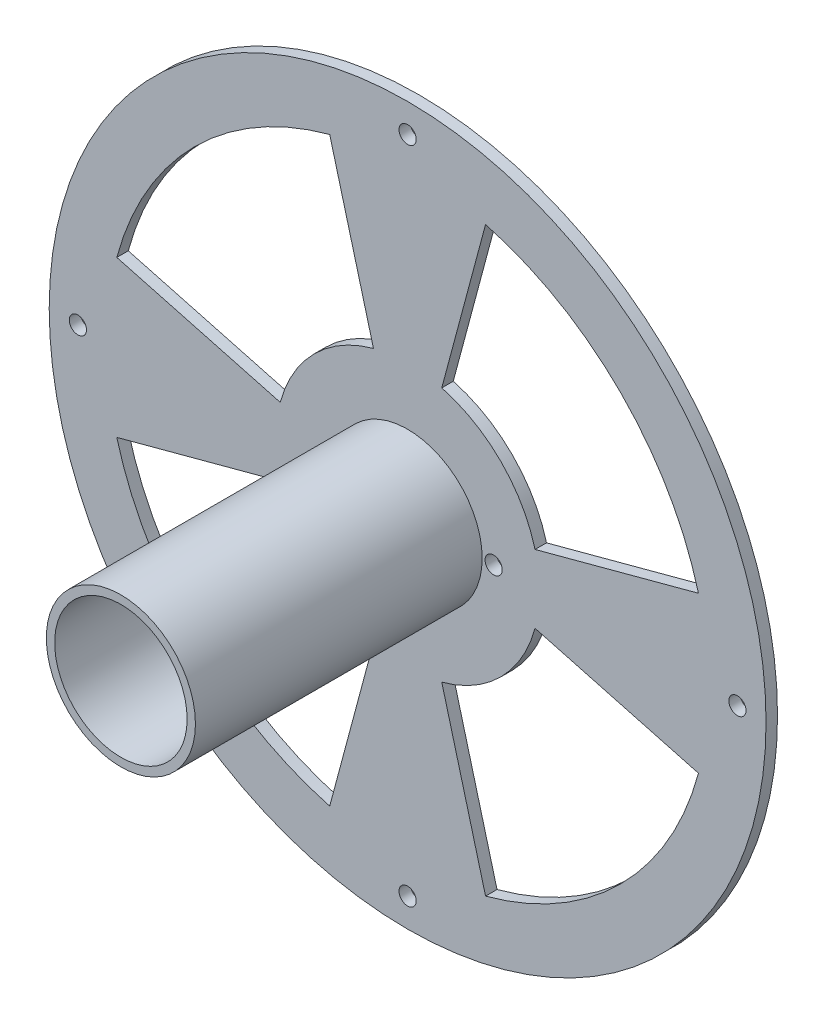
ISO-10303-21;
HEADER;
FILE_DESCRIPTION(('STEP AP214'),'2;1');
FILE_NAME('part.step','',(''),(''),'','','');
FILE_SCHEMA(('AUTOMOTIVE_DESIGN { 1 0 10303 214 1 1 1 1 }'));
ENDSEC;
DATA;
#1=APPLICATION_CONTEXT('core data for automotive mechanical design processes');
#2=APPLICATION_PROTOCOL_DEFINITION('international standard','automotive_design',2000,#1);
#3=PRODUCT_CONTEXT('',#1,'mechanical');
#4=PRODUCT('Part','Part','',(#3));
#5=PRODUCT_RELATED_PRODUCT_CATEGORY('part','',(#4));
#6=PRODUCT_DEFINITION_FORMATION('','',#4);
#7=PRODUCT_DEFINITION_CONTEXT('part definition',#1,'design');
#8=PRODUCT_DEFINITION('design','',#6,#7);
#9=PRODUCT_DEFINITION_SHAPE('','',#8);
#10=(LENGTH_UNIT() NAMED_UNIT(*) SI_UNIT(.MILLI.,.METRE.));
#11=(NAMED_UNIT(*) PLANE_ANGLE_UNIT() SI_UNIT($,.RADIAN.));
#12=(NAMED_UNIT(*) SI_UNIT($,.STERADIAN.) SOLID_ANGLE_UNIT());
#13=UNCERTAINTY_MEASURE_WITH_UNIT(LENGTH_MEASURE(1.E-05),#10,'distance_accuracy_value','');
#14=(GEOMETRIC_REPRESENTATION_CONTEXT(3) GLOBAL_UNCERTAINTY_ASSIGNED_CONTEXT((#13)) GLOBAL_UNIT_ASSIGNED_CONTEXT((#10,
#11,#12)) REPRESENTATION_CONTEXT('',''));
#15=CARTESIAN_POINT('',(0.,0.,0.));
#16=DIRECTION('',(0.,0.,1.));
#17=DIRECTION('',(1.,0.,0.));
#18=AXIS2_PLACEMENT_3D('',#15,#16,#17);
#19=CARTESIAN_POINT('',(0.,0.,2.));
#20=DIRECTION('',(0.,0.,1.));
#21=DIRECTION('',(1.,0.,0.));
#22=AXIS2_PLACEMENT_3D('',#19,#20,#21);
#23=PLANE('',#22);
#24=CARTESIAN_POINT('',(0.,0.,2.));
#25=DIRECTION('',(0.,0.,1.));
#26=DIRECTION('',(1.,0.,0.));
#27=AXIS2_PLACEMENT_3D('',#24,#25,#26);
#28=CIRCLE('',#27,52.5);
#29=CARTESIAN_POINT('',(-50.7111058801761,-13.5879998678824,2.));
#30=VERTEX_POINT('',#29);
#31=CARTESIAN_POINT('',(-13.587999867882,-50.7111058801762,2.));
#32=VERTEX_POINT('',#31);
#33=EDGE_CURVE('E48',#30,#32,#28,.T.);
#34=ORIENTED_EDGE('',*,*,#33,.F.);
#35=DIRECTION('',(-0.965925826289068,-0.258819045102522,0.));
#36=VECTOR('',#35,1.);
#37=CARTESIAN_POINT('',(-22.2162940046486,-5.952838037358,2.));
#38=LINE('',#37,#36);
#39=CARTESIAN_POINT('',(-22.2162940046486,-5.952838037358,2.));
#40=VERTEX_POINT('',#39);
#41=EDGE_CURVE('E167',#40,#30,#38,.T.);
#42=ORIENTED_EDGE('',*,*,#41,.F.);
#43=CARTESIAN_POINT('',(0.,0.,2.));
#44=DIRECTION('',(0.,0.,-1.));
#45=DIRECTION('',(1.,0.,0.));
#46=AXIS2_PLACEMENT_3D('',#43,#44,#45);
#47=CIRCLE('',#46,23.);
#48=CARTESIAN_POINT('',(-5.95283803735783,-22.2162940046486,2.));
#49=VERTEX_POINT('',#48);
#50=EDGE_CURVE('E170',#49,#40,#47,.T.);
#51=ORIENTED_EDGE('',*,*,#50,.F.);
#52=DIRECTION('',(0.258819045102514,0.96592582628907,0.));
#53=VECTOR('',#52,1.);
#54=CARTESIAN_POINT('',(-5.95283803735783,-22.2162940046486,2.));
#55=LINE('',#54,#53);
#56=EDGE_CURVE('E176',#32,#49,#55,.T.);
#57=ORIENTED_EDGE('',*,*,#56,.F.);
#58=EDGE_LOOP('',(#34,#42,#51,#57));
#59=FACE_BOUND('',#58,.T.);
#60=CARTESIAN_POINT('',(0.,0.,2.));
#61=DIRECTION('',(0.,0.,1.));
#62=DIRECTION('',(1.,0.,0.));
#63=AXIS2_PLACEMENT_3D('',#60,#61,#62);
#64=CIRCLE('',#63,52.5);
#65=CARTESIAN_POINT('',(-13.5879998678824,50.7111058801761,2.));
#66=VERTEX_POINT('',#65);
#67=CARTESIAN_POINT('',(-50.7111058801762,13.587999867882,2.));
#68=VERTEX_POINT('',#67);
#69=EDGE_CURVE('E56',#66,#68,#64,.T.);
#70=ORIENTED_EDGE('',*,*,#69,.F.);
#71=DIRECTION('',(-0.258819045102522,0.965925826289068,0.));
#72=VECTOR('',#71,1.);
#73=CARTESIAN_POINT('',(-5.952838037358,22.2162940046486,2.));
#74=LINE('',#73,#72);
#75=CARTESIAN_POINT('',(-5.952838037358,22.2162940046486,2.));
#76=VERTEX_POINT('',#75);
#77=EDGE_CURVE('E191',#76,#66,#74,.T.);
#78=ORIENTED_EDGE('',*,*,#77,.F.);
#79=CARTESIAN_POINT('',(0.,0.,2.));
#80=DIRECTION('',(0.,0.,-1.));
#81=DIRECTION('',(1.,0.,0.));
#82=AXIS2_PLACEMENT_3D('',#79,#80,#81);
#83=CIRCLE('',#82,23.);
#84=CARTESIAN_POINT('',(-22.2162940046486,5.95283803735783,2.));
#85=VERTEX_POINT('',#84);
#86=EDGE_CURVE('E206',#85,#76,#83,.T.);
#87=ORIENTED_EDGE('',*,*,#86,.F.);
#88=DIRECTION('',(0.96592582628907,-0.258819045102514,0.));
#89=VECTOR('',#88,1.);
#90=CARTESIAN_POINT('',(-22.2162940046486,5.95283803735783,2.));
#91=LINE('',#90,#89);
#92=EDGE_CURVE('E202',#68,#85,#91,.T.);
#93=ORIENTED_EDGE('',*,*,#92,.F.);
#94=EDGE_LOOP('',(#70,#78,#87,#93));
#95=FACE_BOUND('',#94,.T.);
#96=CARTESIAN_POINT('',(0.,0.,2.));
#97=DIRECTION('',(0.,0.,1.));
#98=DIRECTION('',(1.,0.,0.));
#99=AXIS2_PLACEMENT_3D('',#96,#97,#98);
#100=CIRCLE('',#99,52.5);
#101=CARTESIAN_POINT('',(50.7111058801761,13.5879998678824,2.));
#102=VERTEX_POINT('',#101);
#103=CARTESIAN_POINT('',(13.587999867882,50.7111058801762,2.));
#104=VERTEX_POINT('',#103);
#105=EDGE_CURVE('E231',#102,#104,#100,.T.);
#106=ORIENTED_EDGE('',*,*,#105,.F.);
#107=DIRECTION('',(0.965925826289068,0.258819045102522,0.));
#108=VECTOR('',#107,1.);
#109=CARTESIAN_POINT('',(22.2162940046486,5.952838037358,2.));
#110=LINE('',#109,#108);
#111=CARTESIAN_POINT('',(22.2162940046486,5.952838037358,2.));
#112=VERTEX_POINT('',#111);
#113=EDGE_CURVE('E221',#112,#102,#110,.T.);
#114=ORIENTED_EDGE('',*,*,#113,.F.);
#115=CARTESIAN_POINT('',(0.,0.,2.));
#116=DIRECTION('',(0.,0.,-1.));
#117=DIRECTION('',(1.,0.,0.));
#118=AXIS2_PLACEMENT_3D('',#115,#116,#117);
#119=CIRCLE('',#118,23.);
#120=CARTESIAN_POINT('',(5.95283803735782,22.2162940046486,2.));
#121=VERTEX_POINT('',#120);
#122=EDGE_CURVE('E236',#121,#112,#119,.T.);
#123=ORIENTED_EDGE('',*,*,#122,.F.);
#124=DIRECTION('',(-0.258819045102514,-0.96592582628907,0.));
#125=VECTOR('',#124,1.);
#126=CARTESIAN_POINT('',(5.95283803735782,22.2162940046486,2.));
#127=LINE('',#126,#125);
#128=EDGE_CURVE('E233',#104,#121,#127,.T.);
#129=ORIENTED_EDGE('',*,*,#128,.F.);
#130=EDGE_LOOP('',(#106,#114,#123,#129));
#131=FACE_BOUND('',#130,.T.);
#132=CARTESIAN_POINT('',(0.,0.,2.));
#133=DIRECTION('',(0.,0.,1.));
#134=DIRECTION('',(1.,0.,0.));
#135=AXIS2_PLACEMENT_3D('',#132,#133,#134);
#136=CIRCLE('',#135,52.5);
#137=CARTESIAN_POINT('',(13.5879998678824,-50.7111058801761,2.));
#138=VERTEX_POINT('',#137);
#139=CARTESIAN_POINT('',(50.7111058801762,-13.587999867882,2.));
#140=VERTEX_POINT('',#139);
#141=EDGE_CURVE('E183',#138,#140,#136,.T.);
#142=ORIENTED_EDGE('',*,*,#141,.F.);
#143=DIRECTION('',(0.258819045102522,-0.965925826289068,0.));
#144=VECTOR('',#143,1.);
#145=CARTESIAN_POINT('',(5.952838037358,-22.2162940046486,2.));
#146=LINE('',#145,#144);
#147=CARTESIAN_POINT('',(5.95283803735799,-22.2162940046486,2.));
#148=VERTEX_POINT('',#147);
#149=EDGE_CURVE('E252',#148,#138,#146,.T.);
#150=ORIENTED_EDGE('',*,*,#149,.F.);
#151=CARTESIAN_POINT('',(0.,0.,2.));
#152=DIRECTION('',(0.,0.,-1.));
#153=DIRECTION('',(1.,0.,0.));
#154=AXIS2_PLACEMENT_3D('',#151,#152,#153);
#155=CIRCLE('',#154,23.);
#156=CARTESIAN_POINT('',(22.2162940046486,-5.95283803735783,2.));
#157=VERTEX_POINT('',#156);
#158=EDGE_CURVE('E266',#157,#148,#155,.T.);
#159=ORIENTED_EDGE('',*,*,#158,.F.);
#160=DIRECTION('',(-0.96592582628907,0.258819045102514,0.));
#161=VECTOR('',#160,1.);
#162=CARTESIAN_POINT('',(22.2162940046486,-5.95283803735783,2.));
#163=LINE('',#162,#161);
#164=EDGE_CURVE('E263',#140,#157,#163,.T.);
#165=ORIENTED_EDGE('',*,*,#164,.F.);
#166=EDGE_LOOP('',(#142,#150,#159,#165));
#167=FACE_BOUND('',#166,.T.);
#168=CARTESIAN_POINT('',(0.,0.,2.));
#169=DIRECTION('',(0.,0.,1.));
#170=DIRECTION('',(1.,0.,0.));
#171=AXIS2_PLACEMENT_3D('',#168,#169,#170);
#172=CIRCLE('',#171,13.);
#173=CARTESIAN_POINT('',(13.,0.,2.));
#174=VERTEX_POINT('',#173);
#175=EDGE_CURVE('E289',#174,#174,#172,.T.);
#176=ORIENTED_EDGE('',*,*,#175,.F.);
#177=EDGE_LOOP('',(#176));
#178=FACE_BOUND('',#177,.T.);
#179=CARTESIAN_POINT('',(-5.95238811855343E-13,-57.5,2.));
#180=DIRECTION('',(0.,0.,1.));
#181=DIRECTION('',(1.,0.,0.));
#182=AXIS2_PLACEMENT_3D('',#179,#180,#181);
#183=CIRCLE('',#182,1.50000000000001);
#184=CARTESIAN_POINT('',(1.49999999999941,-57.5,2.));
#185=VERTEX_POINT('',#184);
#186=EDGE_CURVE('E304',#185,#185,#183,.T.);
#187=ORIENTED_EDGE('',*,*,#186,.F.);
#188=EDGE_LOOP('',(#187));
#189=FACE_BOUND('',#188,.T.);
#190=CARTESIAN_POINT('',(1.93718457888383E-13,57.5,2.));
#191=DIRECTION('',(0.,0.,1.));
#192=DIRECTION('',(1.,0.,0.));
#193=AXIS2_PLACEMENT_3D('',#190,#191,#192);
#194=CIRCLE('',#193,1.5);
#195=CARTESIAN_POINT('',(1.5000000000002,57.5,2.));
#196=VERTEX_POINT('',#195);
#197=EDGE_CURVE('E316',#196,#196,#194,.T.);
#198=ORIENTED_EDGE('',*,*,#197,.F.);
#199=EDGE_LOOP('',(#198));
#200=FACE_BOUND('',#199,.T.);
#201=CARTESIAN_POINT('',(-57.5,0.,2.));
#202=DIRECTION('',(0.,0.,1.));
#203=DIRECTION('',(1.,0.,0.));
#204=AXIS2_PLACEMENT_3D('',#201,#202,#203);
#205=CIRCLE('',#204,1.5);
#206=CARTESIAN_POINT('',(-56.,0.,2.));
#207=VERTEX_POINT('',#206);
#208=EDGE_CURVE('E328',#207,#207,#205,.T.);
#209=ORIENTED_EDGE('',*,*,#208,.F.);
#210=EDGE_LOOP('',(#209));
#211=FACE_BOUND('',#210,.T.);
#212=CARTESIAN_POINT('',(0.,0.,2.));
#213=DIRECTION('',(0.,0.,1.));
#214=DIRECTION('',(1.,0.,0.));
#215=AXIS2_PLACEMENT_3D('',#212,#213,#214);
#216=CIRCLE('',#215,62.5);
#217=CARTESIAN_POINT('',(62.5,0.,2.));
#218=VERTEX_POINT('',#217);
#219=EDGE_CURVE('E11',#218,#218,#216,.T.);
#220=ORIENTED_EDGE('',*,*,#219,.T.);
#221=EDGE_LOOP('',(#220));
#222=FACE_BOUND('',#221,.T.);
#223=CARTESIAN_POINT('',(-15.,0.,2.));
#224=DIRECTION('',(0.,0.,1.));
#225=DIRECTION('',(1.,0.,0.));
#226=AXIS2_PLACEMENT_3D('',#223,#224,#225);
#227=CIRCLE('',#226,1.5);
#228=CARTESIAN_POINT('',(-13.5,0.,2.));
#229=VERTEX_POINT('',#228);
#230=EDGE_CURVE('E322',#229,#229,#227,.T.);
#231=ORIENTED_EDGE('',*,*,#230,.F.);
#232=EDGE_LOOP('',(#231));
#233=FACE_BOUND('',#232,.T.);
#234=CARTESIAN_POINT('',(57.5,-3.94478634871863E-13,2.));
#235=DIRECTION('',(0.,0.,1.));
#236=DIRECTION('',(1.,0.,0.));
#237=AXIS2_PLACEMENT_3D('',#234,#235,#236);
#238=CIRCLE('',#237,1.5);
#239=CARTESIAN_POINT('',(59.,-3.94478634871863E-13,2.));
#240=VERTEX_POINT('',#239);
#241=EDGE_CURVE('E310',#240,#240,#238,.T.);
#242=ORIENTED_EDGE('',*,*,#241,.F.);
#243=EDGE_LOOP('',(#242));
#244=FACE_BOUND('',#243,.T.);
#245=CARTESIAN_POINT('',(15.,0.,2.));
#246=DIRECTION('',(0.,0.,1.));
#247=DIRECTION('',(-1.,0.,0.));
#248=AXIS2_PLACEMENT_3D('',#245,#246,#247);
#249=CIRCLE('',#248,1.5);
#250=CARTESIAN_POINT('',(13.5,0.,2.));
#251=VERTEX_POINT('',#250);
#252=EDGE_CURVE('E298',#251,#251,#249,.T.);
#253=ORIENTED_EDGE('',*,*,#252,.F.);
#254=EDGE_LOOP('',(#253));
#255=FACE_BOUND('',#254,.T.);
#256=ADVANCED_FACE('F33',(#59,#95,#131,#167,#178,#189,#200,#211,#222,#233,#244,#255),#23,.T.);
#257=CARTESIAN_POINT('',(0.,0.,0.));
#258=DIRECTION('',(0.,0.,1.));
#259=DIRECTION('',(1.,0.,0.));
#260=AXIS2_PLACEMENT_3D('',#257,#258,#259);
#261=PLANE('',#260);
#262=DIRECTION('',(-0.965925826289068,-0.258819045102522,0.));
#263=VECTOR('',#262,1.);
#264=CARTESIAN_POINT('',(-22.2162940046486,-5.952838037358,0.));
#265=LINE('',#264,#263);
#266=CARTESIAN_POINT('',(-22.2162940046486,-5.952838037358,0.));
#267=VERTEX_POINT('',#266);
#268=CARTESIAN_POINT('',(-50.7111058801761,-13.5879998678824,0.));
#269=VERTEX_POINT('',#268);
#270=EDGE_CURVE('E154',#267,#269,#265,.T.);
#271=ORIENTED_EDGE('',*,*,#270,.T.);
#272=CARTESIAN_POINT('',(0.,0.,0.));
#273=DIRECTION('',(0.,0.,1.));
#274=DIRECTION('',(1.,0.,0.));
#275=AXIS2_PLACEMENT_3D('',#272,#273,#274);
#276=CIRCLE('',#275,52.5);
#277=CARTESIAN_POINT('',(-13.587999867882,-50.7111058801762,0.));
#278=VERTEX_POINT('',#277);
#279=EDGE_CURVE('E148',#269,#278,#276,.T.);
#280=ORIENTED_EDGE('',*,*,#279,.T.);
#281=DIRECTION('',(0.258819045102514,0.96592582628907,0.));
#282=VECTOR('',#281,1.);
#283=CARTESIAN_POINT('',(-5.95283803735783,-22.2162940046486,0.));
#284=LINE('',#283,#282);
#285=CARTESIAN_POINT('',(-5.95283803735783,-22.2162940046486,0.));
#286=VERTEX_POINT('',#285);
#287=EDGE_CURVE('E158',#278,#286,#284,.T.);
#288=ORIENTED_EDGE('',*,*,#287,.T.);
#289=CARTESIAN_POINT('',(0.,0.,0.));
#290=DIRECTION('',(0.,0.,-1.));
#291=DIRECTION('',(1.,0.,0.));
#292=AXIS2_PLACEMENT_3D('',#289,#290,#291);
#293=CIRCLE('',#292,23.);
#294=EDGE_CURVE('E162',#286,#267,#293,.T.);
#295=ORIENTED_EDGE('',*,*,#294,.T.);
#296=EDGE_LOOP('',(#271,#280,#288,#295));
#297=FACE_BOUND('',#296,.T.);
#298=DIRECTION('',(-0.258819045102522,0.965925826289068,0.));
#299=VECTOR('',#298,1.);
#300=CARTESIAN_POINT('',(-5.952838037358,22.2162940046486,0.));
#301=LINE('',#300,#299);
#302=CARTESIAN_POINT('',(-5.952838037358,22.2162940046486,0.));
#303=VERTEX_POINT('',#302);
#304=CARTESIAN_POINT('',(-13.5879998678824,50.7111058801761,0.));
#305=VERTEX_POINT('',#304);
#306=EDGE_CURVE('E197',#303,#305,#301,.T.);
#307=ORIENTED_EDGE('',*,*,#306,.T.);
#308=CARTESIAN_POINT('',(0.,0.,0.));
#309=DIRECTION('',(0.,0.,1.));
#310=DIRECTION('',(1.,0.,0.));
#311=AXIS2_PLACEMENT_3D('',#308,#309,#310);
#312=CIRCLE('',#311,52.5);
#313=CARTESIAN_POINT('',(-50.7111058801762,13.587999867882,0.));
#314=VERTEX_POINT('',#313);
#315=EDGE_CURVE('E187',#305,#314,#312,.T.);
#316=ORIENTED_EDGE('',*,*,#315,.T.);
#317=DIRECTION('',(0.96592582628907,-0.258819045102514,0.));
#318=VECTOR('',#317,1.);
#319=CARTESIAN_POINT('',(-22.2162940046486,5.95283803735783,0.));
#320=LINE('',#319,#318);
#321=CARTESIAN_POINT('',(-22.2162940046486,5.95283803735783,0.));
#322=VERTEX_POINT('',#321);
#323=EDGE_CURVE('E190',#314,#322,#320,.T.);
#324=ORIENTED_EDGE('',*,*,#323,.T.);
#325=CARTESIAN_POINT('',(0.,0.,0.));
#326=DIRECTION('',(0.,0.,-1.));
#327=DIRECTION('',(1.,0.,0.));
#328=AXIS2_PLACEMENT_3D('',#325,#326,#327);
#329=CIRCLE('',#328,23.);
#330=EDGE_CURVE('E194',#322,#303,#329,.T.);
#331=ORIENTED_EDGE('',*,*,#330,.T.);
#332=EDGE_LOOP('',(#307,#316,#324,#331));
#333=FACE_BOUND('',#332,.T.);
#334=DIRECTION('',(0.965925826289068,0.258819045102522,0.));
#335=VECTOR('',#334,1.);
#336=CARTESIAN_POINT('',(22.2162940046486,5.952838037358,0.));
#337=LINE('',#336,#335);
#338=CARTESIAN_POINT('',(22.2162940046486,5.952838037358,0.));
#339=VERTEX_POINT('',#338);
#340=CARTESIAN_POINT('',(50.7111058801761,13.5879998678824,0.));
#341=VERTEX_POINT('',#340);
#342=EDGE_CURVE('E227',#339,#341,#337,.T.);
#343=ORIENTED_EDGE('',*,*,#342,.T.);
#344=CARTESIAN_POINT('',(0.,0.,0.));
#345=DIRECTION('',(0.,0.,1.));
#346=DIRECTION('',(1.,0.,0.));
#347=AXIS2_PLACEMENT_3D('',#344,#345,#346);
#348=CIRCLE('',#347,52.5);
#349=CARTESIAN_POINT('',(13.587999867882,50.7111058801762,0.));
#350=VERTEX_POINT('',#349);
#351=EDGE_CURVE('E217',#341,#350,#348,.T.);
#352=ORIENTED_EDGE('',*,*,#351,.T.);
#353=DIRECTION('',(-0.258819045102514,-0.96592582628907,0.));
#354=VECTOR('',#353,1.);
#355=CARTESIAN_POINT('',(5.95283803735782,22.2162940046486,0.));
#356=LINE('',#355,#354);
#357=CARTESIAN_POINT('',(5.95283803735782,22.2162940046486,0.));
#358=VERTEX_POINT('',#357);
#359=EDGE_CURVE('E220',#350,#358,#356,.T.);
#360=ORIENTED_EDGE('',*,*,#359,.T.);
#361=CARTESIAN_POINT('',(0.,0.,0.));
#362=DIRECTION('',(0.,0.,-1.));
#363=DIRECTION('',(1.,0.,0.));
#364=AXIS2_PLACEMENT_3D('',#361,#362,#363);
#365=CIRCLE('',#364,23.);
#366=EDGE_CURVE('E224',#358,#339,#365,.T.);
#367=ORIENTED_EDGE('',*,*,#366,.T.);
#368=EDGE_LOOP('',(#343,#352,#360,#367));
#369=FACE_BOUND('',#368,.T.);
#370=DIRECTION('',(0.258819045102522,-0.965925826289068,0.));
#371=VECTOR('',#370,1.);
#372=CARTESIAN_POINT('',(5.952838037358,-22.2162940046486,0.));
#373=LINE('',#372,#371);
#374=CARTESIAN_POINT('',(5.95283803735799,-22.2162940046486,0.));
#375=VERTEX_POINT('',#374);
#376=CARTESIAN_POINT('',(13.5879998678824,-50.7111058801761,0.));
#377=VERTEX_POINT('',#376);
#378=EDGE_CURVE('E258',#375,#377,#373,.T.);
#379=ORIENTED_EDGE('',*,*,#378,.T.);
#380=CARTESIAN_POINT('',(0.,0.,0.));
#381=DIRECTION('',(0.,0.,1.));
#382=DIRECTION('',(1.,0.,0.));
#383=AXIS2_PLACEMENT_3D('',#380,#381,#382);
#384=CIRCLE('',#383,52.5);
#385=CARTESIAN_POINT('',(50.7111058801762,-13.587999867882,0.));
#386=VERTEX_POINT('',#385);
#387=EDGE_CURVE('E248',#377,#386,#384,.T.);
#388=ORIENTED_EDGE('',*,*,#387,.T.);
#389=DIRECTION('',(-0.96592582628907,0.258819045102514,0.));
#390=VECTOR('',#389,1.);
#391=CARTESIAN_POINT('',(22.2162940046486,-5.95283803735783,0.));
#392=LINE('',#391,#390);
#393=CARTESIAN_POINT('',(22.2162940046486,-5.95283803735783,0.));
#394=VERTEX_POINT('',#393);
#395=EDGE_CURVE('E251',#386,#394,#392,.T.);
#396=ORIENTED_EDGE('',*,*,#395,.T.);
#397=CARTESIAN_POINT('',(0.,0.,0.));
#398=DIRECTION('',(0.,0.,-1.));
#399=DIRECTION('',(1.,0.,0.));
#400=AXIS2_PLACEMENT_3D('',#397,#398,#399);
#401=CIRCLE('',#400,23.);
#402=EDGE_CURVE('E255',#394,#375,#401,.T.);
#403=ORIENTED_EDGE('',*,*,#402,.T.);
#404=EDGE_LOOP('',(#379,#388,#396,#403));
#405=FACE_BOUND('',#404,.T.);
#406=CARTESIAN_POINT('',(0.,0.,0.));
#407=DIRECTION('',(0.,0.,1.));
#408=DIRECTION('',(1.,0.,0.));
#409=AXIS2_PLACEMENT_3D('',#406,#407,#408);
#410=CIRCLE('',#409,10.);
#411=CARTESIAN_POINT('',(10.,0.,0.));
#412=VERTEX_POINT('',#411);
#413=EDGE_CURVE('E280',#412,#412,#410,.T.);
#414=ORIENTED_EDGE('',*,*,#413,.T.);
#415=EDGE_LOOP('',(#414));
#416=FACE_BOUND('',#415,.T.);
#417=CARTESIAN_POINT('',(0.,0.,0.));
#418=DIRECTION('',(0.,0.,1.));
#419=DIRECTION('',(1.,0.,0.));
#420=AXIS2_PLACEMENT_3D('',#417,#418,#419);
#421=CIRCLE('',#420,62.5);
#422=CARTESIAN_POINT('',(62.5,0.,0.));
#423=VERTEX_POINT('',#422);
#424=EDGE_CURVE('E37',#423,#423,#421,.T.);
#425=ORIENTED_EDGE('',*,*,#424,.F.);
#426=EDGE_LOOP('',(#425));
#427=FACE_BOUND('',#426,.T.);
#428=CARTESIAN_POINT('',(-57.5,0.,0.));
#429=DIRECTION('',(0.,0.,1.));
#430=DIRECTION('',(1.,0.,0.));
#431=AXIS2_PLACEMENT_3D('',#428,#429,#430);
#432=CIRCLE('',#431,1.5);
#433=CARTESIAN_POINT('',(-56.,0.,0.));
#434=VERTEX_POINT('',#433);
#435=EDGE_CURVE('E325',#434,#434,#432,.T.);
#436=ORIENTED_EDGE('',*,*,#435,.T.);
#437=EDGE_LOOP('',(#436));
#438=FACE_BOUND('',#437,.T.);
#439=CARTESIAN_POINT('',(-15.,0.,0.));
#440=DIRECTION('',(0.,0.,1.));
#441=DIRECTION('',(1.,0.,0.));
#442=AXIS2_PLACEMENT_3D('',#439,#440,#441);
#443=CIRCLE('',#442,1.5);
#444=CARTESIAN_POINT('',(-13.5,0.,0.));
#445=VERTEX_POINT('',#444);
#446=EDGE_CURVE('E319',#445,#445,#443,.T.);
#447=ORIENTED_EDGE('',*,*,#446,.T.);
#448=EDGE_LOOP('',(#447));
#449=FACE_BOUND('',#448,.T.);
#450=CARTESIAN_POINT('',(1.93718457888383E-13,57.5,0.));
#451=DIRECTION('',(0.,0.,1.));
#452=DIRECTION('',(1.,0.,0.));
#453=AXIS2_PLACEMENT_3D('',#450,#451,#452);
#454=CIRCLE('',#453,1.5);
#455=CARTESIAN_POINT('',(1.5000000000002,57.5,0.));
#456=VERTEX_POINT('',#455);
#457=EDGE_CURVE('E313',#456,#456,#454,.T.);
#458=ORIENTED_EDGE('',*,*,#457,.T.);
#459=EDGE_LOOP('',(#458));
#460=FACE_BOUND('',#459,.T.);
#461=CARTESIAN_POINT('',(57.5,-3.94478634871863E-13,0.));
#462=DIRECTION('',(0.,0.,1.));
#463=DIRECTION('',(1.,0.,0.));
#464=AXIS2_PLACEMENT_3D('',#461,#462,#463);
#465=CIRCLE('',#464,1.5);
#466=CARTESIAN_POINT('',(59.,-3.94478634871863E-13,0.));
#467=VERTEX_POINT('',#466);
#468=EDGE_CURVE('E307',#467,#467,#465,.T.);
#469=ORIENTED_EDGE('',*,*,#468,.T.);
#470=EDGE_LOOP('',(#469));
#471=FACE_BOUND('',#470,.T.);
#472=CARTESIAN_POINT('',(-5.95238811855343E-13,-57.5,0.));
#473=DIRECTION('',(0.,0.,1.));
#474=DIRECTION('',(1.,0.,0.));
#475=AXIS2_PLACEMENT_3D('',#472,#473,#474);
#476=CIRCLE('',#475,1.50000000000001);
#477=CARTESIAN_POINT('',(1.49999999999941,-57.5,0.));
#478=VERTEX_POINT('',#477);
#479=EDGE_CURVE('E301',#478,#478,#476,.T.);
#480=ORIENTED_EDGE('',*,*,#479,.T.);
#481=EDGE_LOOP('',(#480));
#482=FACE_BOUND('',#481,.T.);
#483=CARTESIAN_POINT('',(15.,0.,0.));
#484=DIRECTION('',(0.,0.,1.));
#485=DIRECTION('',(-1.,0.,0.));
#486=AXIS2_PLACEMENT_3D('',#483,#484,#485);
#487=CIRCLE('',#486,1.5);
#488=CARTESIAN_POINT('',(13.5,0.,0.));
#489=VERTEX_POINT('',#488);
#490=EDGE_CURVE('E295',#489,#489,#487,.T.);
#491=ORIENTED_EDGE('',*,*,#490,.T.);
#492=EDGE_LOOP('',(#491));
#493=FACE_BOUND('',#492,.T.);
#494=ADVANCED_FACE('F164',(#297,#333,#369,#405,#416,#427,#438,#449,#460,#471,#482,#493),#261,.F.);
#495=CARTESIAN_POINT('',(0.,0.,2.));
#496=DIRECTION('',(0.,0.,-1.));
#497=DIRECTION('',(-1.,0.,0.));
#498=AXIS2_PLACEMENT_3D('',#495,#496,#497);
#499=CYLINDRICAL_SURFACE('',#498,62.5);
#500=ORIENTED_EDGE('',*,*,#219,.F.);
#501=EDGE_LOOP('',(#500));
#502=FACE_BOUND('',#501,.T.);
#503=ORIENTED_EDGE('',*,*,#424,.T.);
#504=EDGE_LOOP('',(#503));
#505=FACE_BOUND('',#504,.T.);
#506=ADVANCED_FACE('F35',(#502,#505),#499,.T.);
#507=CARTESIAN_POINT('',(-57.5,0.,2.));
#508=DIRECTION('',(0.,0.,-1.));
#509=DIRECTION('',(-1.,0.,0.));
#510=AXIS2_PLACEMENT_3D('',#507,#508,#509);
#511=CYLINDRICAL_SURFACE('',#510,1.5);
#512=ORIENTED_EDGE('',*,*,#208,.T.);
#513=EDGE_LOOP('',(#512));
#514=FACE_BOUND('',#513,.T.);
#515=ORIENTED_EDGE('',*,*,#435,.F.);
#516=EDGE_LOOP('',(#515));
#517=FACE_BOUND('',#516,.T.);
#518=ADVANCED_FACE('F336',(#514,#517),#511,.F.);
#519=CARTESIAN_POINT('',(-15.,0.,2.));
#520=DIRECTION('',(0.,0.,-1.));
#521=DIRECTION('',(-1.,0.,0.));
#522=AXIS2_PLACEMENT_3D('',#519,#520,#521);
#523=CYLINDRICAL_SURFACE('',#522,1.5);
#524=ORIENTED_EDGE('',*,*,#230,.T.);
#525=EDGE_LOOP('',(#524));
#526=FACE_BOUND('',#525,.T.);
#527=ORIENTED_EDGE('',*,*,#446,.F.);
#528=EDGE_LOOP('',(#527));
#529=FACE_BOUND('',#528,.T.);
#530=ADVANCED_FACE('F338',(#526,#529),#523,.F.);
#531=CARTESIAN_POINT('',(1.93718457888383E-13,57.5,2.));
#532=DIRECTION('',(0.,0.,-1.));
#533=DIRECTION('',(-1.,0.,0.));
#534=AXIS2_PLACEMENT_3D('',#531,#532,#533);
#535=CYLINDRICAL_SURFACE('',#534,1.5);
#536=ORIENTED_EDGE('',*,*,#197,.T.);
#537=EDGE_LOOP('',(#536));
#538=FACE_BOUND('',#537,.T.);
#539=ORIENTED_EDGE('',*,*,#457,.F.);
#540=EDGE_LOOP('',(#539));
#541=FACE_BOUND('',#540,.T.);
#542=ADVANCED_FACE('F345',(#538,#541),#535,.F.);
#543=CARTESIAN_POINT('',(57.5,-3.94478634871863E-13,2.));
#544=DIRECTION('',(0.,0.,-1.));
#545=DIRECTION('',(-1.,0.,0.));
#546=AXIS2_PLACEMENT_3D('',#543,#544,#545);
#547=CYLINDRICAL_SURFACE('',#546,1.5);
#548=ORIENTED_EDGE('',*,*,#241,.T.);
#549=EDGE_LOOP('',(#548));
#550=FACE_BOUND('',#549,.T.);
#551=ORIENTED_EDGE('',*,*,#468,.F.);
#552=EDGE_LOOP('',(#551));
#553=FACE_BOUND('',#552,.T.);
#554=ADVANCED_FACE('F399',(#550,#553),#547,.F.);
#555=CARTESIAN_POINT('',(-5.95238811855343E-13,-57.5,2.));
#556=DIRECTION('',(0.,0.,-1.));
#557=DIRECTION('',(-1.,0.,0.));
#558=AXIS2_PLACEMENT_3D('',#555,#556,#557);
#559=CYLINDRICAL_SURFACE('',#558,1.50000000000001);
#560=ORIENTED_EDGE('',*,*,#186,.T.);
#561=EDGE_LOOP('',(#560));
#562=FACE_BOUND('',#561,.T.);
#563=ORIENTED_EDGE('',*,*,#479,.F.);
#564=EDGE_LOOP('',(#563));
#565=FACE_BOUND('',#564,.T.);
#566=ADVANCED_FACE('F388',(#562,#565),#559,.F.);
#567=CARTESIAN_POINT('',(15.,0.,2.));
#568=DIRECTION('',(0.,0.,-1.));
#569=DIRECTION('',(-1.,0.,0.));
#570=AXIS2_PLACEMENT_3D('',#567,#568,#569);
#571=CYLINDRICAL_SURFACE('',#570,1.5);
#572=ORIENTED_EDGE('',*,*,#252,.T.);
#573=EDGE_LOOP('',(#572));
#574=FACE_BOUND('',#573,.T.);
#575=ORIENTED_EDGE('',*,*,#490,.F.);
#576=EDGE_LOOP('',(#575));
#577=FACE_BOUND('',#576,.T.);
#578=ADVANCED_FACE('F384',(#574,#577),#571,.F.);
#579=CARTESIAN_POINT('',(0.,0.,52.));
#580=DIRECTION('',(0.,0.,-1.));
#581=DIRECTION('',(-1.,0.,0.));
#582=AXIS2_PLACEMENT_3D('',#579,#580,#581);
#583=CYLINDRICAL_SURFACE('',#582,13.);
#584=CARTESIAN_POINT('',(0.,0.,52.));
#585=DIRECTION('',(0.,0.,1.));
#586=DIRECTION('',(1.,0.,0.));
#587=AXIS2_PLACEMENT_3D('',#584,#585,#586);
#588=CIRCLE('',#587,13.);
#589=CARTESIAN_POINT('',(13.,0.,52.));
#590=VERTEX_POINT('',#589);
#591=EDGE_CURVE('E292',#590,#590,#588,.T.);
#592=ORIENTED_EDGE('',*,*,#591,.F.);
#593=EDGE_LOOP('',(#592));
#594=FACE_BOUND('',#593,.T.);
#595=ORIENTED_EDGE('',*,*,#175,.T.);
#596=EDGE_LOOP('',(#595));
#597=FACE_BOUND('',#596,.T.);
#598=ADVANCED_FACE('F387',(#594,#597),#583,.T.);
#599=CARTESIAN_POINT('',(0.,0.,52.));
#600=DIRECTION('',(0.,0.,1.));
#601=DIRECTION('',(1.,0.,0.));
#602=AXIS2_PLACEMENT_3D('',#599,#600,#601);
#603=PLANE('',#602);
#604=CARTESIAN_POINT('',(0.,0.,52.));
#605=DIRECTION('',(0.,0.,1.));
#606=DIRECTION('',(1.,0.,0.));
#607=AXIS2_PLACEMENT_3D('',#604,#605,#606);
#608=CIRCLE('',#607,11.55);
#609=CARTESIAN_POINT('',(11.55,0.,52.));
#610=VERTEX_POINT('',#609);
#611=EDGE_CURVE('E283',#610,#610,#608,.T.);
#612=ORIENTED_EDGE('',*,*,#611,.F.);
#613=EDGE_LOOP('',(#612));
#614=FACE_BOUND('',#613,.T.);
#615=ORIENTED_EDGE('',*,*,#591,.T.);
#616=EDGE_LOOP('',(#615));
#617=FACE_BOUND('',#616,.T.);
#618=ADVANCED_FACE('F396',(#614,#617),#603,.T.);
#619=CARTESIAN_POINT('',(0.,0.,5.));
#620=DIRECTION('',(0.,0.,1.));
#621=DIRECTION('',(1.,0.,0.));
#622=AXIS2_PLACEMENT_3D('',#619,#620,#621);
#623=CYLINDRICAL_SURFACE('',#622,11.55);
#624=CARTESIAN_POINT('',(0.,0.,5.));
#625=DIRECTION('',(0.,0.,1.));
#626=DIRECTION('',(1.,0.,0.));
#627=AXIS2_PLACEMENT_3D('',#624,#625,#626);
#628=CIRCLE('',#627,11.55);
#629=CARTESIAN_POINT('',(11.55,0.,5.));
#630=VERTEX_POINT('',#629);
#631=EDGE_CURVE('E286',#630,#630,#628,.T.);
#632=ORIENTED_EDGE('',*,*,#631,.F.);
#633=EDGE_LOOP('',(#632));
#634=FACE_BOUND('',#633,.T.);
#635=ORIENTED_EDGE('',*,*,#611,.T.);
#636=EDGE_LOOP('',(#635));
#637=FACE_BOUND('',#636,.T.);
#638=ADVANCED_FACE('F449',(#634,#637),#623,.F.);
#639=CARTESIAN_POINT('',(0.,0.,5.));
#640=DIRECTION('',(0.,0.,1.));
#641=DIRECTION('',(1.,0.,0.));
#642=AXIS2_PLACEMENT_3D('',#639,#640,#641);
#643=PLANE('',#642);
#644=CARTESIAN_POINT('',(0.,0.,5.));
#645=DIRECTION('',(0.,0.,1.));
#646=DIRECTION('',(1.,0.,0.));
#647=AXIS2_PLACEMENT_3D('',#644,#645,#646);
#648=CIRCLE('',#647,10.);
#649=CARTESIAN_POINT('',(10.,0.,5.));
#650=VERTEX_POINT('',#649);
#651=EDGE_CURVE('E273',#650,#650,#648,.T.);
#652=ORIENTED_EDGE('',*,*,#651,.F.);
#653=EDGE_LOOP('',(#652));
#654=FACE_BOUND('',#653,.T.);
#655=ORIENTED_EDGE('',*,*,#631,.T.);
#656=EDGE_LOOP('',(#655));
#657=FACE_BOUND('',#656,.T.);
#658=ADVANCED_FACE('F458',(#654,#657),#643,.T.);
#659=CARTESIAN_POINT('',(0.,0.,0.));
#660=DIRECTION('',(0.,0.,1.));
#661=DIRECTION('',(1.,0.,0.));
#662=AXIS2_PLACEMENT_3D('',#659,#660,#661);
#663=CYLINDRICAL_SURFACE('',#662,10.);
#664=ORIENTED_EDGE('',*,*,#413,.F.);
#665=EDGE_LOOP('',(#664));
#666=FACE_BOUND('',#665,.T.);
#667=ORIENTED_EDGE('',*,*,#651,.T.);
#668=EDGE_LOOP('',(#667));
#669=FACE_BOUND('',#668,.T.);
#670=ADVANCED_FACE('F468',(#666,#669),#663,.F.);
#671=CARTESIAN_POINT('',(0.,0.,0.));
#672=DIRECTION('',(0.,0.,1.));
#673=DIRECTION('',(1.,0.,0.));
#674=AXIS2_PLACEMENT_3D('',#671,#672,#673);
#675=CYLINDRICAL_SURFACE('',#674,52.5);
#676=ORIENTED_EDGE('',*,*,#141,.T.);
#677=DIRECTION('',(0.,0.,1.));
#678=VECTOR('',#677,1.);
#679=CARTESIAN_POINT('',(50.7111058801762,-13.587999867882,0.));
#680=LINE('',#679,#678);
#681=EDGE_CURVE('E261',#386,#140,#680,.T.);
#682=ORIENTED_EDGE('',*,*,#681,.F.);
#683=ORIENTED_EDGE('',*,*,#387,.F.);
#684=DIRECTION('',(0.,0.,1.));
#685=VECTOR('',#684,1.);
#686=CARTESIAN_POINT('',(13.5879998678824,-50.7111058801761,0.));
#687=LINE('',#686,#685);
#688=EDGE_CURVE('E271',#377,#138,#687,.T.);
#689=ORIENTED_EDGE('',*,*,#688,.T.);
#690=EDGE_LOOP('',(#676,#682,#683,#689));
#691=FACE_BOUND('',#690,.T.);
#692=ADVANCED_FACE('F477',(#691),#675,.F.);
#693=CARTESIAN_POINT('',(5.952838037358,-22.2162940046486,0.));
#694=DIRECTION('',(-0.965925826289068,-0.258819045102522,0.));
#695=DIRECTION('',(0.258819045102522,-0.965925826289068,0.));
#696=AXIS2_PLACEMENT_3D('',#693,#694,#695);
#697=PLANE('',#696);
#698=ORIENTED_EDGE('',*,*,#149,.T.);
#699=ORIENTED_EDGE('',*,*,#688,.F.);
#700=ORIENTED_EDGE('',*,*,#378,.F.);
#701=DIRECTION('',(0.,0.,1.));
#702=VECTOR('',#701,1.);
#703=CARTESIAN_POINT('',(5.95283803735799,-22.2162940046486,0.));
#704=LINE('',#703,#702);
#705=EDGE_CURVE('E274',#375,#148,#704,.T.);
#706=ORIENTED_EDGE('',*,*,#705,.T.);
#707=EDGE_LOOP('',(#698,#699,#700,#706));
#708=FACE_BOUND('',#707,.T.);
#709=ADVANCED_FACE('F499',(#708),#697,.F.);
#710=CARTESIAN_POINT('',(0.,0.,0.));
#711=DIRECTION('',(0.,0.,1.));
#712=DIRECTION('',(1.,0.,0.));
#713=AXIS2_PLACEMENT_3D('',#710,#711,#712);
#714=CYLINDRICAL_SURFACE('',#713,23.);
#715=ORIENTED_EDGE('',*,*,#158,.T.);
#716=ORIENTED_EDGE('',*,*,#705,.F.);
#717=ORIENTED_EDGE('',*,*,#402,.F.);
#718=DIRECTION('',(0.,0.,1.));
#719=VECTOR('',#718,1.);
#720=CARTESIAN_POINT('',(22.2162940046486,-5.95283803735783,0.));
#721=LINE('',#720,#719);
#722=EDGE_CURVE('E276',#394,#157,#721,.T.);
#723=ORIENTED_EDGE('',*,*,#722,.T.);
#724=EDGE_LOOP('',(#715,#716,#717,#723));
#725=FACE_BOUND('',#724,.T.);
#726=ADVANCED_FACE('F509',(#725),#714,.T.);
#727=CARTESIAN_POINT('',(22.2162940046486,-5.95283803735783,0.));
#728=DIRECTION('',(0.258819045102514,0.96592582628907,0.));
#729=DIRECTION('',(-0.96592582628907,0.258819045102514,0.));
#730=AXIS2_PLACEMENT_3D('',#727,#728,#729);
#731=PLANE('',#730);
#732=ORIENTED_EDGE('',*,*,#164,.T.);
#733=ORIENTED_EDGE('',*,*,#722,.F.);
#734=ORIENTED_EDGE('',*,*,#395,.F.);
#735=ORIENTED_EDGE('',*,*,#681,.T.);
#736=EDGE_LOOP('',(#732,#733,#734,#735));
#737=FACE_BOUND('',#736,.T.);
#738=ADVANCED_FACE('F519',(#737),#731,.F.);
#739=CARTESIAN_POINT('',(0.,0.,0.));
#740=DIRECTION('',(0.,0.,1.));
#741=DIRECTION('',(1.,0.,0.));
#742=AXIS2_PLACEMENT_3D('',#739,#740,#741);
#743=CYLINDRICAL_SURFACE('',#742,52.5);
#744=ORIENTED_EDGE('',*,*,#105,.T.);
#745=DIRECTION('',(0.,0.,1.));
#746=VECTOR('',#745,1.);
#747=CARTESIAN_POINT('',(13.587999867882,50.7111058801762,0.));
#748=LINE('',#747,#746);
#749=EDGE_CURVE('E230',#350,#104,#748,.T.);
#750=ORIENTED_EDGE('',*,*,#749,.F.);
#751=ORIENTED_EDGE('',*,*,#351,.F.);
#752=DIRECTION('',(0.,0.,1.));
#753=VECTOR('',#752,1.);
#754=CARTESIAN_POINT('',(50.7111058801761,13.5879998678824,0.));
#755=LINE('',#754,#753);
#756=EDGE_CURVE('E203',#341,#102,#755,.T.);
#757=ORIENTED_EDGE('',*,*,#756,.T.);
#758=EDGE_LOOP('',(#744,#750,#751,#757));
#759=FACE_BOUND('',#758,.T.);
#760=ADVANCED_FACE('F529',(#759),#743,.F.);
#761=CARTESIAN_POINT('',(22.2162940046486,5.952838037358,0.));
#762=DIRECTION('',(0.258819045102522,-0.965925826289068,0.));
#763=DIRECTION('',(0.965925826289068,0.258819045102522,0.));
#764=AXIS2_PLACEMENT_3D('',#761,#762,#763);
#765=PLANE('',#764);
#766=ORIENTED_EDGE('',*,*,#113,.T.);
#767=ORIENTED_EDGE('',*,*,#756,.F.);
#768=ORIENTED_EDGE('',*,*,#342,.F.);
#769=DIRECTION('',(0.,0.,1.));
#770=VECTOR('',#769,1.);
#771=CARTESIAN_POINT('',(22.2162940046486,5.952838037358,0.));
#772=LINE('',#771,#770);
#773=EDGE_CURVE('E242',#339,#112,#772,.T.);
#774=ORIENTED_EDGE('',*,*,#773,.T.);
#775=EDGE_LOOP('',(#766,#767,#768,#774));
#776=FACE_BOUND('',#775,.T.);
#777=ADVANCED_FACE('F539',(#776),#765,.F.);
#778=CARTESIAN_POINT('',(0.,0.,0.));
#779=DIRECTION('',(0.,0.,1.));
#780=DIRECTION('',(1.,0.,0.));
#781=AXIS2_PLACEMENT_3D('',#778,#779,#780);
#782=CYLINDRICAL_SURFACE('',#781,23.);
#783=ORIENTED_EDGE('',*,*,#122,.T.);
#784=ORIENTED_EDGE('',*,*,#773,.F.);
#785=ORIENTED_EDGE('',*,*,#366,.F.);
#786=DIRECTION('',(0.,0.,1.));
#787=VECTOR('',#786,1.);
#788=CARTESIAN_POINT('',(5.95283803735782,22.2162940046486,0.));
#789=LINE('',#788,#787);
#790=EDGE_CURVE('E244',#358,#121,#789,.T.);
#791=ORIENTED_EDGE('',*,*,#790,.T.);
#792=EDGE_LOOP('',(#783,#784,#785,#791));
#793=FACE_BOUND('',#792,.T.);
#794=ADVANCED_FACE('F549',(#793),#782,.T.);
#795=CARTESIAN_POINT('',(5.95283803735782,22.2162940046486,0.));
#796=DIRECTION('',(-0.96592582628907,0.258819045102514,0.));
#797=DIRECTION('',(-0.258819045102514,-0.96592582628907,0.));
#798=AXIS2_PLACEMENT_3D('',#795,#796,#797);
#799=PLANE('',#798);
#800=ORIENTED_EDGE('',*,*,#128,.T.);
#801=ORIENTED_EDGE('',*,*,#790,.F.);
#802=ORIENTED_EDGE('',*,*,#359,.F.);
#803=ORIENTED_EDGE('',*,*,#749,.T.);
#804=EDGE_LOOP('',(#800,#801,#802,#803));
#805=FACE_BOUND('',#804,.T.);
#806=ADVANCED_FACE('F559',(#805),#799,.F.);
#807=CARTESIAN_POINT('',(0.,0.,0.));
#808=DIRECTION('',(0.,0.,1.));
#809=DIRECTION('',(1.,0.,0.));
#810=AXIS2_PLACEMENT_3D('',#807,#808,#809);
#811=CYLINDRICAL_SURFACE('',#810,52.5);
#812=ORIENTED_EDGE('',*,*,#69,.T.);
#813=DIRECTION('',(0.,0.,1.));
#814=VECTOR('',#813,1.);
#815=CARTESIAN_POINT('',(-50.7111058801762,13.587999867882,0.));
#816=LINE('',#815,#814);
#817=EDGE_CURVE('E200',#314,#68,#816,.T.);
#818=ORIENTED_EDGE('',*,*,#817,.F.);
#819=ORIENTED_EDGE('',*,*,#315,.F.);
#820=DIRECTION('',(0.,0.,1.));
#821=VECTOR('',#820,1.);
#822=CARTESIAN_POINT('',(-13.5879998678824,50.7111058801761,0.));
#823=LINE('',#822,#821);
#824=EDGE_CURVE('E177',#305,#66,#823,.T.);
#825=ORIENTED_EDGE('',*,*,#824,.T.);
#826=EDGE_LOOP('',(#812,#818,#819,#825));
#827=FACE_BOUND('',#826,.T.);
#828=ADVANCED_FACE('F569',(#827),#811,.F.);
#829=CARTESIAN_POINT('',(-5.952838037358,22.2162940046486,0.));
#830=DIRECTION('',(0.965925826289068,0.258819045102522,0.));
#831=DIRECTION('',(-0.258819045102522,0.965925826289068,0.));
#832=AXIS2_PLACEMENT_3D('',#829,#830,#831);
#833=PLANE('',#832);
#834=ORIENTED_EDGE('',*,*,#77,.T.);
#835=ORIENTED_EDGE('',*,*,#824,.F.);
#836=ORIENTED_EDGE('',*,*,#306,.F.);
#837=DIRECTION('',(0.,0.,1.));
#838=VECTOR('',#837,1.);
#839=CARTESIAN_POINT('',(-5.952838037358,22.2162940046486,0.));
#840=LINE('',#839,#838);
#841=EDGE_CURVE('E212',#303,#76,#840,.T.);
#842=ORIENTED_EDGE('',*,*,#841,.T.);
#843=EDGE_LOOP('',(#834,#835,#836,#842));
#844=FACE_BOUND('',#843,.T.);
#845=ADVANCED_FACE('F579',(#844),#833,.F.);
#846=CARTESIAN_POINT('',(0.,0.,0.));
#847=DIRECTION('',(0.,0.,1.));
#848=DIRECTION('',(1.,0.,0.));
#849=AXIS2_PLACEMENT_3D('',#846,#847,#848);
#850=CYLINDRICAL_SURFACE('',#849,23.);
#851=ORIENTED_EDGE('',*,*,#86,.T.);
#852=ORIENTED_EDGE('',*,*,#841,.F.);
#853=ORIENTED_EDGE('',*,*,#330,.F.);
#854=DIRECTION('',(0.,0.,1.));
#855=VECTOR('',#854,1.);
#856=CARTESIAN_POINT('',(-22.2162940046486,5.95283803735783,0.));
#857=LINE('',#856,#855);
#858=EDGE_CURVE('E214',#322,#85,#857,.T.);
#859=ORIENTED_EDGE('',*,*,#858,.T.);
#860=EDGE_LOOP('',(#851,#852,#853,#859));
#861=FACE_BOUND('',#860,.T.);
#862=ADVANCED_FACE('F588',(#861),#850,.T.);
#863=CARTESIAN_POINT('',(-22.2162940046486,5.95283803735783,0.));
#864=DIRECTION('',(-0.258819045102514,-0.96592582628907,0.));
#865=DIRECTION('',(0.96592582628907,-0.258819045102514,0.));
#866=AXIS2_PLACEMENT_3D('',#863,#864,#865);
#867=PLANE('',#866);
#868=ORIENTED_EDGE('',*,*,#92,.T.);
#869=ORIENTED_EDGE('',*,*,#858,.F.);
#870=ORIENTED_EDGE('',*,*,#323,.F.);
#871=ORIENTED_EDGE('',*,*,#817,.T.);
#872=EDGE_LOOP('',(#868,#869,#870,#871));
#873=FACE_BOUND('',#872,.T.);
#874=ADVANCED_FACE('F598',(#873),#867,.F.);
#875=CARTESIAN_POINT('',(0.,0.,0.));
#876=DIRECTION('',(0.,0.,1.));
#877=DIRECTION('',(1.,0.,0.));
#878=AXIS2_PLACEMENT_3D('',#875,#876,#877);
#879=CYLINDRICAL_SURFACE('',#878,52.5);
#880=ORIENTED_EDGE('',*,*,#33,.T.);
#881=DIRECTION('',(0.,0.,1.));
#882=VECTOR('',#881,1.);
#883=CARTESIAN_POINT('',(-13.587999867882,-50.7111058801762,0.));
#884=LINE('',#883,#882);
#885=EDGE_CURVE('E144',#278,#32,#884,.T.);
#886=ORIENTED_EDGE('',*,*,#885,.F.);
#887=ORIENTED_EDGE('',*,*,#279,.F.);
#888=DIRECTION('',(0.,0.,1.));
#889=VECTOR('',#888,1.);
#890=CARTESIAN_POINT('',(-50.7111058801761,-13.5879998678824,0.));
#891=LINE('',#890,#889);
#892=EDGE_CURVE('E181',#269,#30,#891,.T.);
#893=ORIENTED_EDGE('',*,*,#892,.T.);
#894=EDGE_LOOP('',(#880,#886,#887,#893));
#895=FACE_BOUND('',#894,.T.);
#896=ADVANCED_FACE('F146',(#895),#879,.F.);
#897=CARTESIAN_POINT('',(-22.2162940046486,-5.952838037358,0.));
#898=DIRECTION('',(-0.258819045102522,0.965925826289068,0.));
#899=DIRECTION('',(-0.965925826289068,-0.258819045102522,0.));
#900=AXIS2_PLACEMENT_3D('',#897,#898,#899);
#901=PLANE('',#900);
#902=ORIENTED_EDGE('',*,*,#41,.T.);
#903=ORIENTED_EDGE('',*,*,#892,.F.);
#904=ORIENTED_EDGE('',*,*,#270,.F.);
#905=DIRECTION('',(0.,0.,1.));
#906=VECTOR('',#905,1.);
#907=CARTESIAN_POINT('',(-22.2162940046486,-5.952838037358,0.));
#908=LINE('',#907,#906);
#909=EDGE_CURVE('E184',#267,#40,#908,.T.);
#910=ORIENTED_EDGE('',*,*,#909,.T.);
#911=EDGE_LOOP('',(#902,#903,#904,#910));
#912=FACE_BOUND('',#911,.T.);
#913=ADVANCED_FACE('F617',(#912),#901,.F.);
#914=CARTESIAN_POINT('',(0.,0.,0.));
#915=DIRECTION('',(0.,0.,1.));
#916=DIRECTION('',(1.,0.,0.));
#917=AXIS2_PLACEMENT_3D('',#914,#915,#916);
#918=CYLINDRICAL_SURFACE('',#917,23.);
#919=ORIENTED_EDGE('',*,*,#50,.T.);
#920=ORIENTED_EDGE('',*,*,#909,.F.);
#921=ORIENTED_EDGE('',*,*,#294,.F.);
#922=DIRECTION('',(0.,0.,1.));
#923=VECTOR('',#922,1.);
#924=CARTESIAN_POINT('',(-5.95283803735783,-22.2162940046486,0.));
#925=LINE('',#924,#923);
#926=EDGE_CURVE('E153',#286,#49,#925,.T.);
#927=ORIENTED_EDGE('',*,*,#926,.T.);
#928=EDGE_LOOP('',(#919,#920,#921,#927));
#929=FACE_BOUND('',#928,.T.);
#930=ADVANCED_FACE('F626',(#929),#918,.T.);
#931=CARTESIAN_POINT('',(-5.95283803735783,-22.2162940046486,0.));
#932=DIRECTION('',(0.96592582628907,-0.258819045102514,0.));
#933=DIRECTION('',(0.258819045102514,0.96592582628907,0.));
#934=AXIS2_PLACEMENT_3D('',#931,#932,#933);
#935=PLANE('',#934);
#936=ORIENTED_EDGE('',*,*,#56,.T.);
#937=ORIENTED_EDGE('',*,*,#926,.F.);
#938=ORIENTED_EDGE('',*,*,#287,.F.);
#939=ORIENTED_EDGE('',*,*,#885,.T.);
#940=EDGE_LOOP('',(#936,#937,#938,#939));
#941=FACE_BOUND('',#940,.T.);
#942=ADVANCED_FACE('F159',(#941),#935,.F.);
#943=CLOSED_SHELL('',(#256,#494,#506,#518,#530,#542,#554,#566,#578,#598,#618,#638,#658,#670,
#692,#709,#726,#738,#760,#777,#794,#806,#828,#845,#862,#874,#896,#913,#930,#942));
#944=MANIFOLD_SOLID_BREP('B2',#943);
#945=ADVANCED_BREP_SHAPE_REPRESENTATION('',(#18,#944),#14);
#946=SHAPE_DEFINITION_REPRESENTATION(#9,#945);
ENDSEC;
END-ISO-10303-21;
